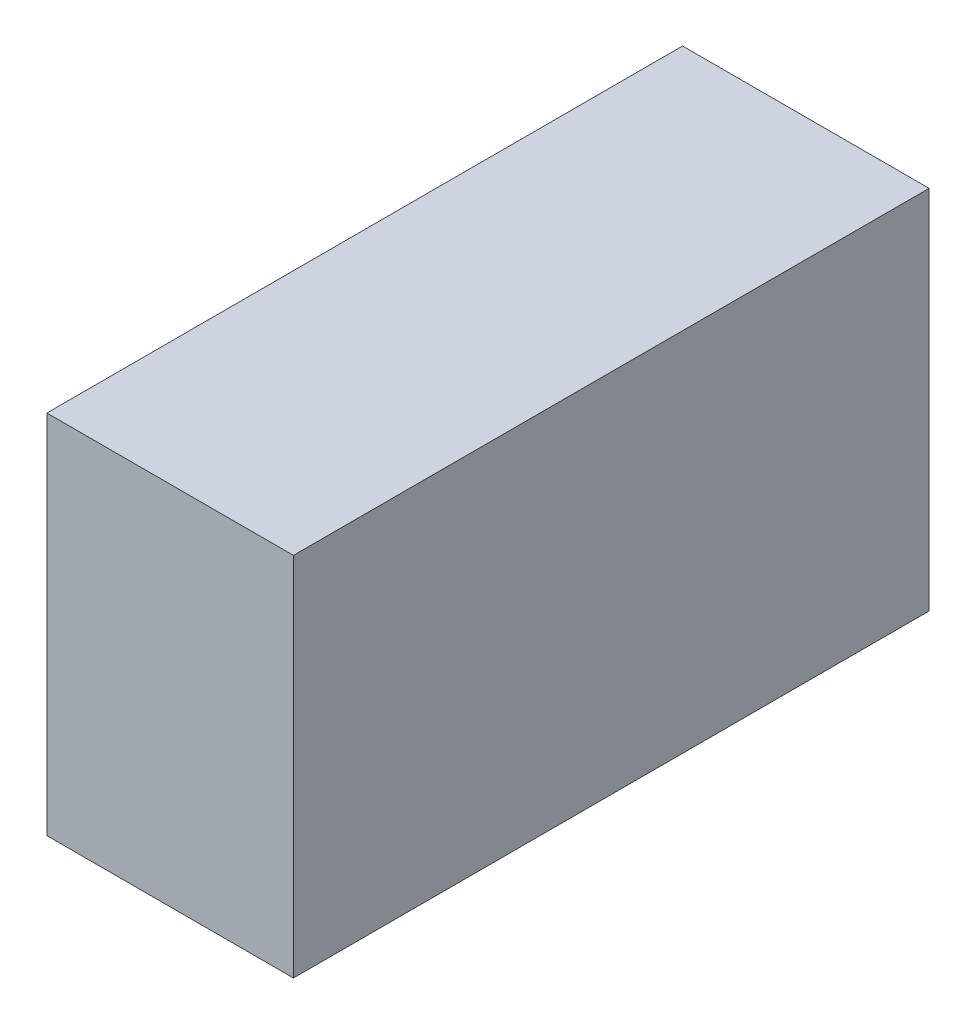
ISO-10303-21;
HEADER;
FILE_DESCRIPTION(('STEP AP214'),'2;1');
FILE_NAME('part.step','',(''),(''),'','','');
FILE_SCHEMA(('AUTOMOTIVE_DESIGN { 1 0 10303 214 1 1 1 1 }'));
ENDSEC;
DATA;
#1=APPLICATION_CONTEXT('core data for automotive mechanical design processes');
#2=APPLICATION_PROTOCOL_DEFINITION('international standard','automotive_design',2000,#1);
#3=PRODUCT_CONTEXT('',#1,'mechanical');
#4=PRODUCT('Part','Part','',(#3));
#5=PRODUCT_RELATED_PRODUCT_CATEGORY('part','',(#4));
#6=PRODUCT_DEFINITION_FORMATION('','',#4);
#7=PRODUCT_DEFINITION_CONTEXT('part definition',#1,'design');
#8=PRODUCT_DEFINITION('design','',#6,#7);
#9=PRODUCT_DEFINITION_SHAPE('','',#8);
#10=(LENGTH_UNIT() NAMED_UNIT(*) SI_UNIT(.MILLI.,.METRE.));
#11=(NAMED_UNIT(*) PLANE_ANGLE_UNIT() SI_UNIT($,.RADIAN.));
#12=(NAMED_UNIT(*) SI_UNIT($,.STERADIAN.) SOLID_ANGLE_UNIT());
#13=UNCERTAINTY_MEASURE_WITH_UNIT(LENGTH_MEASURE(1.E-05),#10,'distance_accuracy_value','');
#14=(GEOMETRIC_REPRESENTATION_CONTEXT(3) GLOBAL_UNCERTAINTY_ASSIGNED_CONTEXT((#13)) GLOBAL_UNIT_ASSIGNED_CONTEXT((#10,
#11,#12)) REPRESENTATION_CONTEXT('',''));
#15=CARTESIAN_POINT('',(0.,0.,0.));
#16=DIRECTION('',(0.,0.,1.));
#17=DIRECTION('',(1.,0.,0.));
#18=AXIS2_PLACEMENT_3D('',#15,#16,#17);
#19=CARTESIAN_POINT('',(0.,0.,165.));
#20=DIRECTION('',(1.,0.,0.));
#21=DIRECTION('',(0.,0.,-1.));
#22=AXIS2_PLACEMENT_3D('',#19,#20,#21);
#23=PLANE('',#22);
#24=DIRECTION('',(0.,-1.,0.));
#25=VECTOR('',#24,1.);
#26=CARTESIAN_POINT('',(0.,0.,0.));
#27=LINE('',#26,#25);
#28=CARTESIAN_POINT('',(0.,95.,0.));
#29=VERTEX_POINT('',#28);
#30=CARTESIAN_POINT('',(0.,0.,0.));
#31=VERTEX_POINT('',#30);
#32=EDGE_CURVE('E95',#29,#31,#27,.T.);
#33=ORIENTED_EDGE('',*,*,#32,.T.);
#34=DIRECTION('',(0.,0.,-1.));
#35=VECTOR('',#34,1.);
#36=CARTESIAN_POINT('',(0.,0.,165.));
#37=LINE('',#36,#35);
#38=CARTESIAN_POINT('',(0.,0.,165.));
#39=VERTEX_POINT('',#38);
#40=EDGE_CURVE('E11',#39,#31,#37,.T.);
#41=ORIENTED_EDGE('',*,*,#40,.F.);
#42=DIRECTION('',(0.,-1.,0.));
#43=VECTOR('',#42,1.);
#44=CARTESIAN_POINT('',(0.,0.,165.));
#45=LINE('',#44,#43);
#46=CARTESIAN_POINT('',(0.,95.,165.));
#47=VERTEX_POINT('',#46);
#48=EDGE_CURVE('E83',#47,#39,#45,.T.);
#49=ORIENTED_EDGE('',*,*,#48,.F.);
#50=DIRECTION('',(0.,0.,-1.));
#51=VECTOR('',#50,1.);
#52=CARTESIAN_POINT('',(0.,95.,165.));
#53=LINE('',#52,#51);
#54=EDGE_CURVE('E91',#47,#29,#53,.T.);
#55=ORIENTED_EDGE('',*,*,#54,.T.);
#56=EDGE_LOOP('',(#33,#41,#49,#55));
#57=FACE_BOUND('',#56,.T.);
#58=ADVANCED_FACE('F32',(#57),#23,.F.);
#59=CARTESIAN_POINT('',(0.,0.,165.));
#60=DIRECTION('',(0.,1.,0.));
#61=DIRECTION('',(0.,0.,1.));
#62=AXIS2_PLACEMENT_3D('',#59,#60,#61);
#63=PLANE('',#62);
#64=DIRECTION('',(1.,0.,0.));
#65=VECTOR('',#64,1.);
#66=CARTESIAN_POINT('',(0.,0.,0.));
#67=LINE('',#66,#65);
#68=CARTESIAN_POINT('',(64.,0.,0.));
#69=VERTEX_POINT('',#68);
#70=EDGE_CURVE('E87',#31,#69,#67,.T.);
#71=ORIENTED_EDGE('',*,*,#70,.T.);
#72=DIRECTION('',(0.,0.,-1.));
#73=VECTOR('',#72,1.);
#74=CARTESIAN_POINT('',(64.,0.,165.));
#75=LINE('',#74,#73);
#76=CARTESIAN_POINT('',(64.,0.,165.));
#77=VERTEX_POINT('',#76);
#78=EDGE_CURVE('E40',#77,#69,#75,.T.);
#79=ORIENTED_EDGE('',*,*,#78,.F.);
#80=DIRECTION('',(1.,0.,0.));
#81=VECTOR('',#80,1.);
#82=CARTESIAN_POINT('',(0.,0.,165.));
#83=LINE('',#82,#81);
#84=EDGE_CURVE('E78',#39,#77,#83,.T.);
#85=ORIENTED_EDGE('',*,*,#84,.F.);
#86=ORIENTED_EDGE('',*,*,#40,.T.);
#87=EDGE_LOOP('',(#71,#79,#85,#86));
#88=FACE_BOUND('',#87,.T.);
#89=ADVANCED_FACE('F86',(#88),#63,.F.);
#90=CARTESIAN_POINT('',(64.,0.,165.));
#91=DIRECTION('',(-1.,0.,0.));
#92=DIRECTION('',(0.,0.,1.));
#93=AXIS2_PLACEMENT_3D('',#90,#91,#92);
#94=PLANE('',#93);
#95=DIRECTION('',(0.,1.,0.));
#96=VECTOR('',#95,1.);
#97=CARTESIAN_POINT('',(64.,0.,0.));
#98=LINE('',#97,#96);
#99=CARTESIAN_POINT('',(64.,95.,0.));
#100=VERTEX_POINT('',#99);
#101=EDGE_CURVE('E65',#69,#100,#98,.T.);
#102=ORIENTED_EDGE('',*,*,#101,.T.);
#103=DIRECTION('',(0.,0.,-1.));
#104=VECTOR('',#103,1.);
#105=CARTESIAN_POINT('',(64.,95.,165.));
#106=LINE('',#105,#104);
#107=CARTESIAN_POINT('',(64.,95.,165.));
#108=VERTEX_POINT('',#107);
#109=EDGE_CURVE('E88',#108,#100,#106,.T.);
#110=ORIENTED_EDGE('',*,*,#109,.F.);
#111=DIRECTION('',(0.,1.,0.));
#112=VECTOR('',#111,1.);
#113=CARTESIAN_POINT('',(64.,0.,165.));
#114=LINE('',#113,#112);
#115=EDGE_CURVE('E81',#77,#108,#114,.T.);
#116=ORIENTED_EDGE('',*,*,#115,.F.);
#117=ORIENTED_EDGE('',*,*,#78,.T.);
#118=EDGE_LOOP('',(#102,#110,#116,#117));
#119=FACE_BOUND('',#118,.T.);
#120=ADVANCED_FACE('F89',(#119),#94,.F.);
#121=CARTESIAN_POINT('',(0.,95.,165.));
#122=DIRECTION('',(0.,-1.,0.));
#123=DIRECTION('',(0.,0.,-1.));
#124=AXIS2_PLACEMENT_3D('',#121,#122,#123);
#125=PLANE('',#124);
#126=DIRECTION('',(-1.,0.,0.));
#127=VECTOR('',#126,1.);
#128=CARTESIAN_POINT('',(0.,95.,0.));
#129=LINE('',#128,#127);
#130=EDGE_CURVE('E71',#100,#29,#129,.T.);
#131=ORIENTED_EDGE('',*,*,#130,.T.);
#132=ORIENTED_EDGE('',*,*,#54,.F.);
#133=DIRECTION('',(-1.,0.,0.));
#134=VECTOR('',#133,1.);
#135=CARTESIAN_POINT('',(0.,95.,165.));
#136=LINE('',#135,#134);
#137=EDGE_CURVE('E48',#108,#47,#136,.T.);
#138=ORIENTED_EDGE('',*,*,#137,.F.);
#139=ORIENTED_EDGE('',*,*,#109,.T.);
#140=EDGE_LOOP('',(#131,#132,#138,#139));
#141=FACE_BOUND('',#140,.T.);
#142=ADVANCED_FACE('F102',(#141),#125,.F.);
#143=CARTESIAN_POINT('',(0.,0.,165.));
#144=DIRECTION('',(0.,0.,-1.));
#145=DIRECTION('',(-1.,0.,0.));
#146=AXIS2_PLACEMENT_3D('',#143,#144,#145);
#147=PLANE('',#146);
#148=ORIENTED_EDGE('',*,*,#48,.T.);
#149=ORIENTED_EDGE('',*,*,#84,.T.);
#150=ORIENTED_EDGE('',*,*,#115,.T.);
#151=ORIENTED_EDGE('',*,*,#137,.T.);
#152=EDGE_LOOP('',(#148,#149,#150,#151));
#153=FACE_BOUND('',#152,.T.);
#154=ADVANCED_FACE('F79',(#153),#147,.F.);
#155=CARTESIAN_POINT('',(0.,0.,0.));
#156=DIRECTION('',(0.,0.,-1.));
#157=DIRECTION('',(-1.,0.,0.));
#158=AXIS2_PLACEMENT_3D('',#155,#156,#157);
#159=PLANE('',#158);
#160=ORIENTED_EDGE('',*,*,#32,.F.);
#161=ORIENTED_EDGE('',*,*,#130,.F.);
#162=ORIENTED_EDGE('',*,*,#101,.F.);
#163=ORIENTED_EDGE('',*,*,#70,.F.);
#164=EDGE_LOOP('',(#160,#161,#162,#163));
#165=FACE_BOUND('',#164,.T.);
#166=ADVANCED_FACE('F105',(#165),#159,.T.);
#167=CLOSED_SHELL('',(#58,#89,#120,#142,#154,#166));
#168=MANIFOLD_SOLID_BREP('B2',#167);
#169=ADVANCED_BREP_SHAPE_REPRESENTATION('',(#18,#168),#14);
#170=SHAPE_DEFINITION_REPRESENTATION(#9,#169);
ENDSEC;
END-ISO-10303-21;
